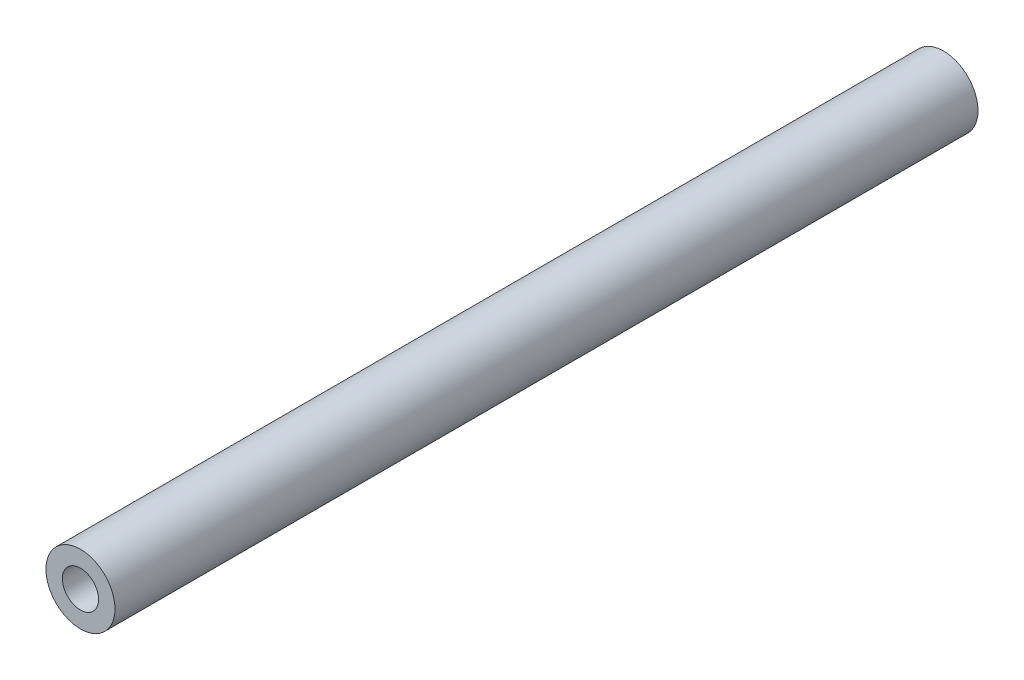
ISO-10303-21;
HEADER;
FILE_DESCRIPTION(('STEP AP214'),'2;1');
FILE_NAME('part.step','',(''),(''),'','','');
FILE_SCHEMA(('AUTOMOTIVE_DESIGN { 1 0 10303 214 1 1 1 1 }'));
ENDSEC;
DATA;
#1=APPLICATION_CONTEXT('core data for automotive mechanical design processes');
#2=APPLICATION_PROTOCOL_DEFINITION('international standard','automotive_design',2000,#1);
#3=PRODUCT_CONTEXT('',#1,'mechanical');
#4=PRODUCT('Part','Part','',(#3));
#5=PRODUCT_RELATED_PRODUCT_CATEGORY('part','',(#4));
#6=PRODUCT_DEFINITION_FORMATION('','',#4);
#7=PRODUCT_DEFINITION_CONTEXT('part definition',#1,'design');
#8=PRODUCT_DEFINITION('design','',#6,#7);
#9=PRODUCT_DEFINITION_SHAPE('','',#8);
#10=(LENGTH_UNIT() NAMED_UNIT(*) SI_UNIT(.MILLI.,.METRE.));
#11=(NAMED_UNIT(*) PLANE_ANGLE_UNIT() SI_UNIT($,.RADIAN.));
#12=(NAMED_UNIT(*) SI_UNIT($,.STERADIAN.) SOLID_ANGLE_UNIT());
#13=UNCERTAINTY_MEASURE_WITH_UNIT(LENGTH_MEASURE(1.E-05),#10,'distance_accuracy_value','');
#14=(GEOMETRIC_REPRESENTATION_CONTEXT(3) GLOBAL_UNCERTAINTY_ASSIGNED_CONTEXT((#13)) GLOBAL_UNIT_ASSIGNED_CONTEXT((#10,
#11,#12)) REPRESENTATION_CONTEXT('',''));
#15=CARTESIAN_POINT('',(0.,0.,0.));
#16=DIRECTION('',(0.,0.,1.));
#17=DIRECTION('',(1.,0.,0.));
#18=AXIS2_PLACEMENT_3D('',#15,#16,#17);
#19=CARTESIAN_POINT('',(0.,0.,50.));
#20=DIRECTION('',(0.,0.,-1.));
#21=DIRECTION('',(-1.,0.,0.));
#22=AXIS2_PLACEMENT_3D('',#19,#20,#21);
#23=CYLINDRICAL_SURFACE('',#22,4.);
#24=CARTESIAN_POINT('',(0.,0.,50.));
#25=DIRECTION('',(0.,0.,1.));
#26=DIRECTION('',(1.,0.,0.));
#27=AXIS2_PLACEMENT_3D('',#24,#25,#26);
#28=CIRCLE('',#27,4.);
#29=CARTESIAN_POINT('',(4.,0.,50.));
#30=VERTEX_POINT('',#29);
#31=EDGE_CURVE('E11',#30,#30,#28,.T.);
#32=ORIENTED_EDGE('',*,*,#31,.F.);
#33=EDGE_LOOP('',(#32));
#34=FACE_BOUND('',#33,.T.);
#35=CARTESIAN_POINT('',(0.,0.,-50.));
#36=DIRECTION('',(0.,0.,1.));
#37=DIRECTION('',(1.,0.,0.));
#38=AXIS2_PLACEMENT_3D('',#35,#36,#37);
#39=CIRCLE('',#38,4.);
#40=CARTESIAN_POINT('',(4.,0.,-50.));
#41=VERTEX_POINT('',#40);
#42=EDGE_CURVE('E43',#41,#41,#39,.T.);
#43=ORIENTED_EDGE('',*,*,#42,.T.);
#44=EDGE_LOOP('',(#43));
#45=FACE_BOUND('',#44,.T.);
#46=ADVANCED_FACE('F40',(#34,#45),#23,.T.);
#47=CARTESIAN_POINT('',(0.,0.,50.));
#48=DIRECTION('',(0.,0.,1.));
#49=DIRECTION('',(1.,0.,0.));
#50=AXIS2_PLACEMENT_3D('',#47,#48,#49);
#51=PLANE('',#50);
#52=CARTESIAN_POINT('',(0.,0.,50.));
#53=DIRECTION('',(0.,0.,1.));
#54=DIRECTION('',(1.,0.,0.));
#55=AXIS2_PLACEMENT_3D('',#52,#53,#54);
#56=CIRCLE('',#55,2.1);
#57=CARTESIAN_POINT('',(2.1,0.,50.));
#58=VERTEX_POINT('',#57);
#59=EDGE_CURVE('E63',#58,#58,#56,.T.);
#60=ORIENTED_EDGE('',*,*,#59,.F.);
#61=EDGE_LOOP('',(#60));
#62=FACE_BOUND('',#61,.T.);
#63=ORIENTED_EDGE('',*,*,#31,.T.);
#64=EDGE_LOOP('',(#63));
#65=FACE_BOUND('',#64,.T.);
#66=ADVANCED_FACE('F82',(#62,#65),#51,.T.);
#67=CARTESIAN_POINT('',(0.,0.,-50.));
#68=DIRECTION('',(0.,0.,1.));
#69=DIRECTION('',(1.,0.,0.));
#70=AXIS2_PLACEMENT_3D('',#67,#68,#69);
#71=PLANE('',#70);
#72=CARTESIAN_POINT('',(0.,0.,-50.));
#73=DIRECTION('',(0.,0.,-1.));
#74=DIRECTION('',(-1.,0.,0.));
#75=AXIS2_PLACEMENT_3D('',#72,#73,#74);
#76=CIRCLE('',#75,2.1);
#77=CARTESIAN_POINT('',(-2.1,0.,-50.));
#78=VERTEX_POINT('',#77);
#79=EDGE_CURVE('E64',#78,#78,#76,.T.);
#80=ORIENTED_EDGE('',*,*,#79,.F.);
#81=EDGE_LOOP('',(#80));
#82=FACE_BOUND('',#81,.T.);
#83=ORIENTED_EDGE('',*,*,#42,.F.);
#84=EDGE_LOOP('',(#83));
#85=FACE_BOUND('',#84,.T.);
#86=ADVANCED_FACE('F79',(#82,#85),#71,.F.);
#87=CARTESIAN_POINT('',(0.,0.,37.6));
#88=DIRECTION('',(0.,0.,1.));
#89=DIRECTION('',(1.,0.,0.));
#90=AXIS2_PLACEMENT_3D('',#87,#88,#89);
#91=CONICAL_SURFACE('',#90,2.1,1.02974425867665);
#92=CARTESIAN_POINT('',(0.,0.,36.3381927000421));
#93=VERTEX_POINT('',#92);
#94=VERTEX_LOOP('',#93);
#95=FACE_BOUND('',#94,.T.);
#96=CARTESIAN_POINT('',(0.,0.,37.6));
#97=DIRECTION('',(0.,0.,1.));
#98=DIRECTION('',(1.,0.,0.));
#99=AXIS2_PLACEMENT_3D('',#96,#97,#98);
#100=CIRCLE('',#99,2.1);
#101=CARTESIAN_POINT('',(2.1,0.,37.6));
#102=VERTEX_POINT('',#101);
#103=EDGE_CURVE('E67',#102,#102,#100,.T.);
#104=ORIENTED_EDGE('',*,*,#103,.T.);
#105=EDGE_LOOP('',(#104));
#106=FACE_BOUND('',#105,.T.);
#107=ADVANCED_FACE('F81',(#95,#106),#91,.F.);
#108=CARTESIAN_POINT('',(0.,0.,50.));
#109=DIRECTION('',(0.,0.,1.));
#110=DIRECTION('',(1.,0.,0.));
#111=AXIS2_PLACEMENT_3D('',#108,#109,#110);
#112=CYLINDRICAL_SURFACE('',#111,2.1);
#113=ORIENTED_EDGE('',*,*,#103,.F.);
#114=EDGE_LOOP('',(#113));
#115=FACE_BOUND('',#114,.T.);
#116=ORIENTED_EDGE('',*,*,#59,.T.);
#117=EDGE_LOOP('',(#116));
#118=FACE_BOUND('',#117,.T.);
#119=ADVANCED_FACE('F57',(#115,#118),#112,.F.);
#120=CARTESIAN_POINT('',(0.,0.,-37.6));
#121=DIRECTION('',(0.,0.,-1.));
#122=DIRECTION('',(-1.,0.,0.));
#123=AXIS2_PLACEMENT_3D('',#120,#121,#122);
#124=CONICAL_SURFACE('',#123,2.1,1.02974425867665);
#125=CARTESIAN_POINT('',(0.,0.,-36.3381927000421));
#126=VERTEX_POINT('',#125);
#127=VERTEX_LOOP('',#126);
#128=FACE_BOUND('',#127,.T.);
#129=CARTESIAN_POINT('',(0.,0.,-37.6));
#130=DIRECTION('',(0.,0.,-1.));
#131=DIRECTION('',(-1.,0.,0.));
#132=AXIS2_PLACEMENT_3D('',#129,#130,#131);
#133=CIRCLE('',#132,2.1);
#134=CARTESIAN_POINT('',(-2.1,0.,-37.6));
#135=VERTEX_POINT('',#134);
#136=EDGE_CURVE('E61',#135,#135,#133,.T.);
#137=ORIENTED_EDGE('',*,*,#136,.T.);
#138=EDGE_LOOP('',(#137));
#139=FACE_BOUND('',#138,.T.);
#140=ADVANCED_FACE('F53',(#128,#139),#124,.F.);
#141=CARTESIAN_POINT('',(0.,0.,-50.));
#142=DIRECTION('',(0.,0.,-1.));
#143=DIRECTION('',(-1.,0.,0.));
#144=AXIS2_PLACEMENT_3D('',#141,#142,#143);
#145=CYLINDRICAL_SURFACE('',#144,2.1);
#146=ORIENTED_EDGE('',*,*,#136,.F.);
#147=EDGE_LOOP('',(#146));
#148=FACE_BOUND('',#147,.T.);
#149=ORIENTED_EDGE('',*,*,#79,.T.);
#150=EDGE_LOOP('',(#149));
#151=FACE_BOUND('',#150,.T.);
#152=ADVANCED_FACE('F56',(#148,#151),#145,.F.);
#153=CLOSED_SHELL('',(#46,#66,#86,#107,#119,#140,#152));
#154=MANIFOLD_SOLID_BREP('B2',#153);
#155=ADVANCED_BREP_SHAPE_REPRESENTATION('',(#18,#154),#14);
#156=SHAPE_DEFINITION_REPRESENTATION(#9,#155);
ENDSEC;
END-ISO-10303-21;
